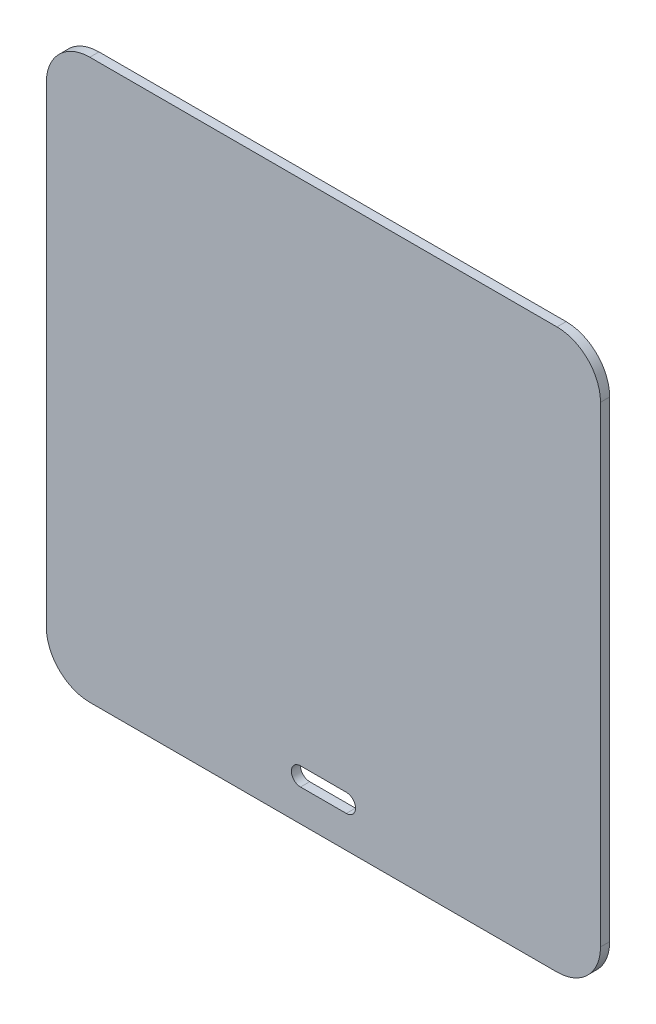
ISO-10303-21;
HEADER;
FILE_DESCRIPTION(('STEP AP214'),'2;1');
FILE_NAME('part.step','',(''),(''),'','','');
FILE_SCHEMA(('AUTOMOTIVE_DESIGN { 1 0 10303 214 1 1 1 1 }'));
ENDSEC;
DATA;
#1=APPLICATION_CONTEXT('core data for automotive mechanical design processes');
#2=APPLICATION_PROTOCOL_DEFINITION('international standard','automotive_design',2000,#1);
#3=PRODUCT_CONTEXT('',#1,'mechanical');
#4=PRODUCT('Part','Part','',(#3));
#5=PRODUCT_RELATED_PRODUCT_CATEGORY('part','',(#4));
#6=PRODUCT_DEFINITION_FORMATION('','',#4);
#7=PRODUCT_DEFINITION_CONTEXT('part definition',#1,'design');
#8=PRODUCT_DEFINITION('design','',#6,#7);
#9=PRODUCT_DEFINITION_SHAPE('','',#8);
#10=(LENGTH_UNIT() NAMED_UNIT(*) SI_UNIT(.MILLI.,.METRE.));
#11=(NAMED_UNIT(*) PLANE_ANGLE_UNIT() SI_UNIT($,.RADIAN.));
#12=(NAMED_UNIT(*) SI_UNIT($,.STERADIAN.) SOLID_ANGLE_UNIT());
#13=UNCERTAINTY_MEASURE_WITH_UNIT(LENGTH_MEASURE(1.E-05),#10,'distance_accuracy_value','');
#14=(GEOMETRIC_REPRESENTATION_CONTEXT(3) GLOBAL_UNCERTAINTY_ASSIGNED_CONTEXT((#13)) GLOBAL_UNIT_ASSIGNED_CONTEXT((#10,
#11,#12)) REPRESENTATION_CONTEXT('',''));
#15=CARTESIAN_POINT('',(0.,0.,0.));
#16=DIRECTION('',(0.,0.,1.));
#17=DIRECTION('',(1.,0.,0.));
#18=AXIS2_PLACEMENT_3D('',#15,#16,#17);
#19=CARTESIAN_POINT('',(-25.5,25.75,1.));
#20=DIRECTION('',(0.,0.,1.));
#21=DIRECTION('',(1.,0.,0.));
#22=AXIS2_PLACEMENT_3D('',#19,#20,#21);
#23=PLANE('',#22);
#24=CARTESIAN_POINT('',(-25.5,25.75,1.));
#25=DIRECTION('',(0.,0.,1.));
#26=DIRECTION('',(1.,0.,0.));
#27=AXIS2_PLACEMENT_3D('',#24,#25,#26);
#28=CIRCLE('',#27,4.74999999999999);
#29=CARTESIAN_POINT('',(-25.5,30.5,1.));
#30=VERTEX_POINT('',#29);
#31=CARTESIAN_POINT('',(-30.25,25.75,1.));
#32=VERTEX_POINT('',#31);
#33=EDGE_CURVE('E212',#30,#32,#28,.T.);
#34=ORIENTED_EDGE('',*,*,#33,.T.);
#35=DIRECTION('',(0.,-1.,0.));
#36=VECTOR('',#35,1.);
#37=CARTESIAN_POINT('',(-30.25,25.75,1.));
#38=LINE('',#37,#36);
#39=CARTESIAN_POINT('',(-30.25,-25.75,1.));
#40=VERTEX_POINT('',#39);
#41=EDGE_CURVE('E216',#32,#40,#38,.T.);
#42=ORIENTED_EDGE('',*,*,#41,.T.);
#43=CARTESIAN_POINT('',(-25.5,-25.75,1.));
#44=DIRECTION('',(0.,0.,-1.));
#45=DIRECTION('',(-1.,0.,0.));
#46=AXIS2_PLACEMENT_3D('',#43,#44,#45);
#47=CIRCLE('',#46,4.74999999999999);
#48=CARTESIAN_POINT('',(-25.5,-30.5,1.));
#49=VERTEX_POINT('',#48);
#50=EDGE_CURVE('E220',#49,#40,#47,.T.);
#51=ORIENTED_EDGE('',*,*,#50,.F.);
#52=DIRECTION('',(1.,0.,0.));
#53=VECTOR('',#52,1.);
#54=CARTESIAN_POINT('',(-25.5,-30.5,1.));
#55=LINE('',#54,#53);
#56=CARTESIAN_POINT('',(25.5,-30.5,1.));
#57=VERTEX_POINT('',#56);
#58=EDGE_CURVE('E224',#49,#57,#55,.T.);
#59=ORIENTED_EDGE('',*,*,#58,.T.);
#60=CARTESIAN_POINT('',(25.5,-25.75,1.));
#61=DIRECTION('',(0.,0.,1.));
#62=DIRECTION('',(1.,0.,0.));
#63=AXIS2_PLACEMENT_3D('',#60,#61,#62);
#64=CIRCLE('',#63,4.74999999999999);
#65=CARTESIAN_POINT('',(30.25,-25.75,1.));
#66=VERTEX_POINT('',#65);
#67=EDGE_CURVE('E227',#57,#66,#64,.T.);
#68=ORIENTED_EDGE('',*,*,#67,.T.);
#69=DIRECTION('',(0.,1.,0.));
#70=VECTOR('',#69,1.);
#71=CARTESIAN_POINT('',(30.25,-25.75,1.));
#72=LINE('',#71,#70);
#73=CARTESIAN_POINT('',(30.25,25.75,1.));
#74=VERTEX_POINT('',#73);
#75=EDGE_CURVE('E230',#66,#74,#72,.T.);
#76=ORIENTED_EDGE('',*,*,#75,.T.);
#77=CARTESIAN_POINT('',(25.5,25.75,1.));
#78=DIRECTION('',(0.,0.,-1.));
#79=DIRECTION('',(-1.,0.,0.));
#80=AXIS2_PLACEMENT_3D('',#77,#78,#79);
#81=CIRCLE('',#80,4.75);
#82=CARTESIAN_POINT('',(25.5,30.5,1.));
#83=VERTEX_POINT('',#82);
#84=EDGE_CURVE('E233',#83,#74,#81,.T.);
#85=ORIENTED_EDGE('',*,*,#84,.F.);
#86=DIRECTION('',(-1.,0.,0.));
#87=VECTOR('',#86,1.);
#88=CARTESIAN_POINT('',(25.5,30.5,1.));
#89=LINE('',#88,#87);
#90=EDGE_CURVE('E237',#83,#30,#89,.T.);
#91=ORIENTED_EDGE('',*,*,#90,.T.);
#92=EDGE_LOOP('',(#34,#42,#51,#59,#68,#76,#85,#91));
#93=FACE_BOUND('',#92,.T.);
#94=DIRECTION('',(1.,0.,0.));
#95=VECTOR('',#94,1.);
#96=CARTESIAN_POINT('',(-2.49999999999999,-25.,1.));
#97=LINE('',#96,#95);
#98=CARTESIAN_POINT('',(-2.49999999999999,-25.,1.));
#99=VERTEX_POINT('',#98);
#100=CARTESIAN_POINT('',(2.50000000000001,-25.,1.));
#101=VERTEX_POINT('',#100);
#102=EDGE_CURVE('E174',#99,#101,#97,.T.);
#103=ORIENTED_EDGE('',*,*,#102,.T.);
#104=CARTESIAN_POINT('',(2.50000000000001,-26.,1.));
#105=DIRECTION('',(0.,0.,1.));
#106=DIRECTION('',(1.,0.,0.));
#107=AXIS2_PLACEMENT_3D('',#104,#105,#106);
#108=CIRCLE('',#107,1.);
#109=CARTESIAN_POINT('',(2.50000000000001,-27.,1.));
#110=VERTEX_POINT('',#109);
#111=EDGE_CURVE('E163',#110,#101,#108,.T.);
#112=ORIENTED_EDGE('',*,*,#111,.F.);
#113=DIRECTION('',(-1.,0.,0.));
#114=VECTOR('',#113,1.);
#115=CARTESIAN_POINT('',(2.50000000000001,-27.,1.));
#116=LINE('',#115,#114);
#117=CARTESIAN_POINT('',(-2.49999999999999,-27.,1.));
#118=VERTEX_POINT('',#117);
#119=EDGE_CURVE('E189',#110,#118,#116,.T.);
#120=ORIENTED_EDGE('',*,*,#119,.T.);
#121=CARTESIAN_POINT('',(-2.49999999999999,-26.,1.));
#122=DIRECTION('',(0.,0.,-1.));
#123=DIRECTION('',(-1.,0.,0.));
#124=AXIS2_PLACEMENT_3D('',#121,#122,#123);
#125=CIRCLE('',#124,1.);
#126=EDGE_CURVE('E91',#118,#99,#125,.T.);
#127=ORIENTED_EDGE('',*,*,#126,.T.);
#128=EDGE_LOOP('',(#103,#112,#120,#127));
#129=FACE_BOUND('',#128,.T.);
#130=ADVANCED_FACE('F75',(#93,#129),#23,.T.);
#131=CARTESIAN_POINT('',(-25.5,25.75,0.));
#132=DIRECTION('',(0.,0.,1.));
#133=DIRECTION('',(1.,0.,0.));
#134=AXIS2_PLACEMENT_3D('',#131,#132,#133);
#135=PLANE('',#134);
#136=CARTESIAN_POINT('',(-25.5,25.75,0.));
#137=DIRECTION('',(0.,0.,1.));
#138=DIRECTION('',(1.,0.,0.));
#139=AXIS2_PLACEMENT_3D('',#136,#137,#138);
#140=CIRCLE('',#139,4.74999999999999);
#141=CARTESIAN_POINT('',(-25.5,30.5,0.));
#142=VERTEX_POINT('',#141);
#143=CARTESIAN_POINT('',(-30.25,25.75,0.));
#144=VERTEX_POINT('',#143);
#145=EDGE_CURVE('E183',#142,#144,#140,.T.);
#146=ORIENTED_EDGE('',*,*,#145,.F.);
#147=DIRECTION('',(-1.,0.,0.));
#148=VECTOR('',#147,1.);
#149=CARTESIAN_POINT('',(25.5,30.5,0.));
#150=LINE('',#149,#148);
#151=CARTESIAN_POINT('',(25.5,30.5,0.));
#152=VERTEX_POINT('',#151);
#153=EDGE_CURVE('E217',#152,#142,#150,.T.);
#154=ORIENTED_EDGE('',*,*,#153,.F.);
#155=CARTESIAN_POINT('',(25.5,25.75,0.));
#156=DIRECTION('',(0.,0.,-1.));
#157=DIRECTION('',(-1.,0.,0.));
#158=AXIS2_PLACEMENT_3D('',#155,#156,#157);
#159=CIRCLE('',#158,4.75);
#160=CARTESIAN_POINT('',(30.25,25.75,0.));
#161=VERTEX_POINT('',#160);
#162=EDGE_CURVE('E262',#152,#161,#159,.T.);
#163=ORIENTED_EDGE('',*,*,#162,.T.);
#164=DIRECTION('',(0.,1.,0.));
#165=VECTOR('',#164,1.);
#166=CARTESIAN_POINT('',(30.25,-25.75,0.));
#167=LINE('',#166,#165);
#168=CARTESIAN_POINT('',(30.25,-25.75,0.));
#169=VERTEX_POINT('',#168);
#170=EDGE_CURVE('E258',#169,#161,#167,.T.);
#171=ORIENTED_EDGE('',*,*,#170,.F.);
#172=CARTESIAN_POINT('',(25.5,-25.75,0.));
#173=DIRECTION('',(0.,0.,1.));
#174=DIRECTION('',(1.,0.,0.));
#175=AXIS2_PLACEMENT_3D('',#172,#173,#174);
#176=CIRCLE('',#175,4.74999999999999);
#177=CARTESIAN_POINT('',(25.5,-30.5,0.));
#178=VERTEX_POINT('',#177);
#179=EDGE_CURVE('E255',#178,#169,#176,.T.);
#180=ORIENTED_EDGE('',*,*,#179,.F.);
#181=DIRECTION('',(1.,0.,0.));
#182=VECTOR('',#181,1.);
#183=CARTESIAN_POINT('',(-25.5,-30.5,0.));
#184=LINE('',#183,#182);
#185=CARTESIAN_POINT('',(-25.5,-30.5,0.));
#186=VERTEX_POINT('',#185);
#187=EDGE_CURVE('E252',#186,#178,#184,.T.);
#188=ORIENTED_EDGE('',*,*,#187,.F.);
#189=CARTESIAN_POINT('',(-25.5,-25.75,0.));
#190=DIRECTION('',(0.,0.,-1.));
#191=DIRECTION('',(-1.,0.,0.));
#192=AXIS2_PLACEMENT_3D('',#189,#190,#191);
#193=CIRCLE('',#192,4.74999999999999);
#194=CARTESIAN_POINT('',(-30.25,-25.75,0.));
#195=VERTEX_POINT('',#194);
#196=EDGE_CURVE('E248',#186,#195,#193,.T.);
#197=ORIENTED_EDGE('',*,*,#196,.T.);
#198=DIRECTION('',(0.,-1.,0.));
#199=VECTOR('',#198,1.);
#200=CARTESIAN_POINT('',(-30.25,25.75,0.));
#201=LINE('',#200,#199);
#202=EDGE_CURVE('E244',#144,#195,#201,.T.);
#203=ORIENTED_EDGE('',*,*,#202,.F.);
#204=EDGE_LOOP('',(#146,#154,#163,#171,#180,#188,#197,#203));
#205=FACE_BOUND('',#204,.T.);
#206=CARTESIAN_POINT('',(2.50000000000001,-26.,0.));
#207=DIRECTION('',(0.,0.,1.));
#208=DIRECTION('',(1.,0.,0.));
#209=AXIS2_PLACEMENT_3D('',#206,#207,#208);
#210=CIRCLE('',#209,1.);
#211=CARTESIAN_POINT('',(2.50000000000001,-27.,0.));
#212=VERTEX_POINT('',#211);
#213=CARTESIAN_POINT('',(2.50000000000001,-25.,0.));
#214=VERTEX_POINT('',#213);
#215=EDGE_CURVE('E99',#212,#214,#210,.T.);
#216=ORIENTED_EDGE('',*,*,#215,.T.);
#217=DIRECTION('',(1.,0.,0.));
#218=VECTOR('',#217,1.);
#219=CARTESIAN_POINT('',(-2.49999999999999,-25.,0.));
#220=LINE('',#219,#218);
#221=CARTESIAN_POINT('',(-2.49999999999999,-25.,0.));
#222=VERTEX_POINT('',#221);
#223=EDGE_CURVE('E181',#222,#214,#220,.T.);
#224=ORIENTED_EDGE('',*,*,#223,.F.);
#225=CARTESIAN_POINT('',(-2.49999999999999,-26.,0.));
#226=DIRECTION('',(0.,0.,-1.));
#227=DIRECTION('',(-1.,0.,0.));
#228=AXIS2_PLACEMENT_3D('',#225,#226,#227);
#229=CIRCLE('',#228,1.);
#230=CARTESIAN_POINT('',(-2.49999999999999,-27.,0.));
#231=VERTEX_POINT('',#230);
#232=EDGE_CURVE('E198',#231,#222,#229,.T.);
#233=ORIENTED_EDGE('',*,*,#232,.F.);
#234=DIRECTION('',(-1.,0.,0.));
#235=VECTOR('',#234,1.);
#236=CARTESIAN_POINT('',(2.50000000000001,-27.,0.));
#237=LINE('',#236,#235);
#238=EDGE_CURVE('E175',#212,#231,#237,.T.);
#239=ORIENTED_EDGE('',*,*,#238,.F.);
#240=EDGE_LOOP('',(#216,#224,#233,#239));
#241=FACE_BOUND('',#240,.T.);
#242=ADVANCED_FACE('F299',(#205,#241),#135,.F.);
#243=CARTESIAN_POINT('',(-25.5,25.75,1.));
#244=DIRECTION('',(0.,0.,-1.));
#245=DIRECTION('',(-1.,0.,0.));
#246=AXIS2_PLACEMENT_3D('',#243,#244,#245);
#247=CYLINDRICAL_SURFACE('',#246,4.74999999999999);
#248=ORIENTED_EDGE('',*,*,#145,.T.);
#249=DIRECTION('',(0.,0.,-1.));
#250=VECTOR('',#249,1.);
#251=CARTESIAN_POINT('',(-30.25,25.75,1.));
#252=LINE('',#251,#250);
#253=EDGE_CURVE('E12',#32,#144,#252,.T.);
#254=ORIENTED_EDGE('',*,*,#253,.F.);
#255=ORIENTED_EDGE('',*,*,#33,.F.);
#256=DIRECTION('',(0.,0.,-1.));
#257=VECTOR('',#256,1.);
#258=CARTESIAN_POINT('',(-25.5,30.5,1.));
#259=LINE('',#258,#257);
#260=EDGE_CURVE('E240',#30,#142,#259,.T.);
#261=ORIENTED_EDGE('',*,*,#260,.T.);
#262=EDGE_LOOP('',(#248,#254,#255,#261));
#263=FACE_BOUND('',#262,.T.);
#264=ADVANCED_FACE('F77',(#263),#247,.T.);
#265=CARTESIAN_POINT('',(-30.25,25.75,1.));
#266=DIRECTION('',(1.,0.,0.));
#267=DIRECTION('',(0.,0.,-1.));
#268=AXIS2_PLACEMENT_3D('',#265,#266,#267);
#269=PLANE('',#268);
#270=ORIENTED_EDGE('',*,*,#202,.T.);
#271=DIRECTION('',(0.,0.,-1.));
#272=VECTOR('',#271,1.);
#273=CARTESIAN_POINT('',(-30.25,-25.75,1.));
#274=LINE('',#273,#272);
#275=EDGE_CURVE('E84',#40,#195,#274,.T.);
#276=ORIENTED_EDGE('',*,*,#275,.F.);
#277=ORIENTED_EDGE('',*,*,#41,.F.);
#278=ORIENTED_EDGE('',*,*,#253,.T.);
#279=EDGE_LOOP('',(#270,#276,#277,#278));
#280=FACE_BOUND('',#279,.T.);
#281=ADVANCED_FACE('F294',(#280),#269,.F.);
#282=CARTESIAN_POINT('',(-25.5,-25.75,1.));
#283=DIRECTION('',(0.,0.,-1.));
#284=DIRECTION('',(-1.,0.,0.));
#285=AXIS2_PLACEMENT_3D('',#282,#283,#284);
#286=CYLINDRICAL_SURFACE('',#285,4.74999999999999);
#287=ORIENTED_EDGE('',*,*,#196,.F.);
#288=DIRECTION('',(0.,0.,-1.));
#289=VECTOR('',#288,1.);
#290=CARTESIAN_POINT('',(-25.5,-30.5,1.));
#291=LINE('',#290,#289);
#292=EDGE_CURVE('E285',#49,#186,#291,.T.);
#293=ORIENTED_EDGE('',*,*,#292,.F.);
#294=ORIENTED_EDGE('',*,*,#50,.T.);
#295=ORIENTED_EDGE('',*,*,#275,.T.);
#296=EDGE_LOOP('',(#287,#293,#294,#295));
#297=FACE_BOUND('',#296,.T.);
#298=ADVANCED_FACE('F291',(#297),#286,.T.);
#299=CARTESIAN_POINT('',(-25.5,-30.5,1.));
#300=DIRECTION('',(0.,1.,0.));
#301=DIRECTION('',(-1.,0.,0.));
#302=AXIS2_PLACEMENT_3D('',#299,#300,#301);
#303=PLANE('',#302);
#304=ORIENTED_EDGE('',*,*,#187,.T.);
#305=DIRECTION('',(0.,0.,-1.));
#306=VECTOR('',#305,1.);
#307=CARTESIAN_POINT('',(25.5,-30.5,1.));
#308=LINE('',#307,#306);
#309=EDGE_CURVE('E281',#57,#178,#308,.T.);
#310=ORIENTED_EDGE('',*,*,#309,.F.);
#311=ORIENTED_EDGE('',*,*,#58,.F.);
#312=ORIENTED_EDGE('',*,*,#292,.T.);
#313=EDGE_LOOP('',(#304,#310,#311,#312));
#314=FACE_BOUND('',#313,.T.);
#315=ADVANCED_FACE('F305',(#314),#303,.F.);
#316=CARTESIAN_POINT('',(25.5,-25.75,1.));
#317=DIRECTION('',(0.,0.,-1.));
#318=DIRECTION('',(-1.,0.,0.));
#319=AXIS2_PLACEMENT_3D('',#316,#317,#318);
#320=CYLINDRICAL_SURFACE('',#319,4.74999999999999);
#321=ORIENTED_EDGE('',*,*,#179,.T.);
#322=DIRECTION('',(0.,0.,-1.));
#323=VECTOR('',#322,1.);
#324=CARTESIAN_POINT('',(30.25,-25.75,1.));
#325=LINE('',#324,#323);
#326=EDGE_CURVE('E277',#66,#169,#325,.T.);
#327=ORIENTED_EDGE('',*,*,#326,.F.);
#328=ORIENTED_EDGE('',*,*,#67,.F.);
#329=ORIENTED_EDGE('',*,*,#309,.T.);
#330=EDGE_LOOP('',(#321,#327,#328,#329));
#331=FACE_BOUND('',#330,.T.);
#332=ADVANCED_FACE('F309',(#331),#320,.T.);
#333=CARTESIAN_POINT('',(30.25,-25.75,1.));
#334=DIRECTION('',(-1.,0.,0.));
#335=DIRECTION('',(0.,0.,1.));
#336=AXIS2_PLACEMENT_3D('',#333,#334,#335);
#337=PLANE('',#336);
#338=ORIENTED_EDGE('',*,*,#170,.T.);
#339=DIRECTION('',(0.,0.,-1.));
#340=VECTOR('',#339,1.);
#341=CARTESIAN_POINT('',(30.25,25.75,1.));
#342=LINE('',#341,#340);
#343=EDGE_CURVE('E274',#74,#161,#342,.T.);
#344=ORIENTED_EDGE('',*,*,#343,.F.);
#345=ORIENTED_EDGE('',*,*,#75,.F.);
#346=ORIENTED_EDGE('',*,*,#326,.T.);
#347=EDGE_LOOP('',(#338,#344,#345,#346));
#348=FACE_BOUND('',#347,.T.);
#349=ADVANCED_FACE('F325',(#348),#337,.F.);
#350=CARTESIAN_POINT('',(25.5,25.75,1.));
#351=DIRECTION('',(0.,0.,-1.));
#352=DIRECTION('',(-1.,0.,0.));
#353=AXIS2_PLACEMENT_3D('',#350,#351,#352);
#354=CYLINDRICAL_SURFACE('',#353,4.75);
#355=ORIENTED_EDGE('',*,*,#162,.F.);
#356=DIRECTION('',(0.,0.,-1.));
#357=VECTOR('',#356,1.);
#358=CARTESIAN_POINT('',(25.5,30.5,1.));
#359=LINE('',#358,#357);
#360=EDGE_CURVE('E271',#83,#152,#359,.T.);
#361=ORIENTED_EDGE('',*,*,#360,.F.);
#362=ORIENTED_EDGE('',*,*,#84,.T.);
#363=ORIENTED_EDGE('',*,*,#343,.T.);
#364=EDGE_LOOP('',(#355,#361,#362,#363));
#365=FACE_BOUND('',#364,.T.);
#366=ADVANCED_FACE('F323',(#365),#354,.T.);
#367=CARTESIAN_POINT('',(25.5,30.5,1.));
#368=DIRECTION('',(0.,-1.,0.));
#369=DIRECTION('',(1.,0.,0.));
#370=AXIS2_PLACEMENT_3D('',#367,#368,#369);
#371=PLANE('',#370);
#372=ORIENTED_EDGE('',*,*,#153,.T.);
#373=ORIENTED_EDGE('',*,*,#260,.F.);
#374=ORIENTED_EDGE('',*,*,#90,.F.);
#375=ORIENTED_EDGE('',*,*,#360,.T.);
#376=EDGE_LOOP('',(#372,#373,#374,#375));
#377=FACE_BOUND('',#376,.T.);
#378=ADVANCED_FACE('F332',(#377),#371,.F.);
#379=CARTESIAN_POINT('',(2.50000000000001,-26.,1.));
#380=DIRECTION('',(0.,0.,-1.));
#381=DIRECTION('',(-1.,0.,0.));
#382=AXIS2_PLACEMENT_3D('',#379,#380,#381);
#383=CYLINDRICAL_SURFACE('',#382,1.);
#384=ORIENTED_EDGE('',*,*,#215,.F.);
#385=DIRECTION('',(0.,0.,-1.));
#386=VECTOR('',#385,1.);
#387=CARTESIAN_POINT('',(2.50000000000001,-27.,1.));
#388=LINE('',#387,#386);
#389=EDGE_CURVE('E168',#110,#212,#388,.T.);
#390=ORIENTED_EDGE('',*,*,#389,.F.);
#391=ORIENTED_EDGE('',*,*,#111,.T.);
#392=DIRECTION('',(0.,0.,-1.));
#393=VECTOR('',#392,1.);
#394=CARTESIAN_POINT('',(2.50000000000001,-25.,1.));
#395=LINE('',#394,#393);
#396=EDGE_CURVE('E166',#101,#214,#395,.T.);
#397=ORIENTED_EDGE('',*,*,#396,.T.);
#398=EDGE_LOOP('',(#384,#390,#391,#397));
#399=FACE_BOUND('',#398,.T.);
#400=ADVANCED_FACE('F165',(#399),#383,.F.);
#401=CARTESIAN_POINT('',(-2.49999999999999,-25.,1.));
#402=DIRECTION('',(0.,1.,0.));
#403=DIRECTION('',(0.,0.,1.));
#404=AXIS2_PLACEMENT_3D('',#401,#402,#403);
#405=PLANE('',#404);
#406=ORIENTED_EDGE('',*,*,#223,.T.);
#407=ORIENTED_EDGE('',*,*,#396,.F.);
#408=ORIENTED_EDGE('',*,*,#102,.F.);
#409=DIRECTION('',(0.,0.,-1.));
#410=VECTOR('',#409,1.);
#411=CARTESIAN_POINT('',(-2.49999999999999,-25.,1.));
#412=LINE('',#411,#410);
#413=EDGE_CURVE('E184',#99,#222,#412,.T.);
#414=ORIENTED_EDGE('',*,*,#413,.T.);
#415=EDGE_LOOP('',(#406,#407,#408,#414));
#416=FACE_BOUND('',#415,.T.);
#417=ADVANCED_FACE('F179',(#416),#405,.F.);
#418=CARTESIAN_POINT('',(-2.49999999999999,-26.,1.));
#419=DIRECTION('',(0.,0.,-1.));
#420=DIRECTION('',(-1.,0.,0.));
#421=AXIS2_PLACEMENT_3D('',#418,#419,#420);
#422=CYLINDRICAL_SURFACE('',#421,1.);
#423=ORIENTED_EDGE('',*,*,#232,.T.);
#424=ORIENTED_EDGE('',*,*,#413,.F.);
#425=ORIENTED_EDGE('',*,*,#126,.F.);
#426=DIRECTION('',(0.,0.,-1.));
#427=VECTOR('',#426,1.);
#428=CARTESIAN_POINT('',(-2.49999999999999,-27.,1.));
#429=LINE('',#428,#427);
#430=EDGE_CURVE('E207',#118,#231,#429,.T.);
#431=ORIENTED_EDGE('',*,*,#430,.T.);
#432=EDGE_LOOP('',(#423,#424,#425,#431));
#433=FACE_BOUND('',#432,.T.);
#434=ADVANCED_FACE('F351',(#433),#422,.F.);
#435=CARTESIAN_POINT('',(2.50000000000001,-27.,1.));
#436=DIRECTION('',(0.,-1.,0.));
#437=DIRECTION('',(0.,0.,-1.));
#438=AXIS2_PLACEMENT_3D('',#435,#436,#437);
#439=PLANE('',#438);
#440=ORIENTED_EDGE('',*,*,#238,.T.);
#441=ORIENTED_EDGE('',*,*,#430,.F.);
#442=ORIENTED_EDGE('',*,*,#119,.F.);
#443=ORIENTED_EDGE('',*,*,#389,.T.);
#444=EDGE_LOOP('',(#440,#441,#442,#443));
#445=FACE_BOUND('',#444,.T.);
#446=ADVANCED_FACE('F355',(#445),#439,.F.);
#447=CLOSED_SHELL('',(#130,#242,#264,#281,#298,#315,#332,#349,#366,#378,#400,#417,#434,#446));
#448=MANIFOLD_SOLID_BREP('B2',#447);
#449=ADVANCED_BREP_SHAPE_REPRESENTATION('',(#18,#448),#14);
#450=SHAPE_DEFINITION_REPRESENTATION(#9,#449);
ENDSEC;
END-ISO-10303-21;
